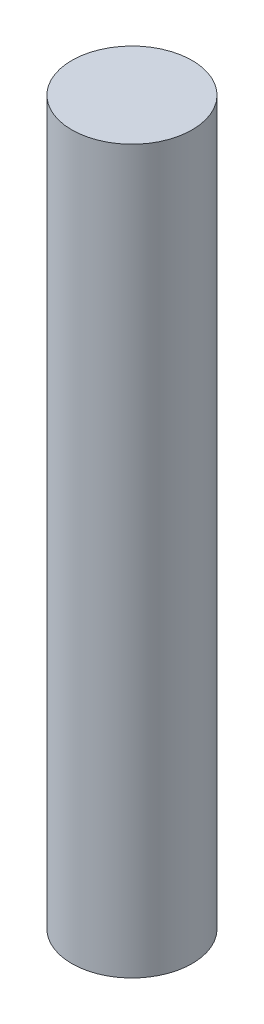
ISO-10303-21;
HEADER;
FILE_DESCRIPTION(('STEP AP214'),'2;1');
FILE_NAME('part.step','',(''),(''),'','','');
FILE_SCHEMA(('AUTOMOTIVE_DESIGN { 1 0 10303 214 1 1 1 1 }'));
ENDSEC;
DATA;
#1=APPLICATION_CONTEXT('core data for automotive mechanical design processes');
#2=APPLICATION_PROTOCOL_DEFINITION('international standard','automotive_design',2000,#1);
#3=PRODUCT_CONTEXT('',#1,'mechanical');
#4=PRODUCT('Part','Part','',(#3));
#5=PRODUCT_RELATED_PRODUCT_CATEGORY('part','',(#4));
#6=PRODUCT_DEFINITION_FORMATION('','',#4);
#7=PRODUCT_DEFINITION_CONTEXT('part definition',#1,'design');
#8=PRODUCT_DEFINITION('design','',#6,#7);
#9=PRODUCT_DEFINITION_SHAPE('','',#8);
#10=(LENGTH_UNIT() NAMED_UNIT(*) SI_UNIT(.MILLI.,.METRE.));
#11=(NAMED_UNIT(*) PLANE_ANGLE_UNIT() SI_UNIT($,.RADIAN.));
#12=(NAMED_UNIT(*) SI_UNIT($,.STERADIAN.) SOLID_ANGLE_UNIT());
#13=UNCERTAINTY_MEASURE_WITH_UNIT(LENGTH_MEASURE(1.E-05),#10,'distance_accuracy_value','');
#14=(GEOMETRIC_REPRESENTATION_CONTEXT(3) GLOBAL_UNCERTAINTY_ASSIGNED_CONTEXT((#13)) GLOBAL_UNIT_ASSIGNED_CONTEXT((#10,
#11,#12)) REPRESENTATION_CONTEXT('',''));
#15=CARTESIAN_POINT('',(0.,0.,0.));
#16=DIRECTION('',(0.,0.,1.));
#17=DIRECTION('',(1.,0.,0.));
#18=AXIS2_PLACEMENT_3D('',#15,#16,#17);
#19=CARTESIAN_POINT('',(0.,30.,0.));
#20=DIRECTION('',(0.,-1.,0.));
#21=DIRECTION('',(0.,0.,-1.));
#22=AXIS2_PLACEMENT_3D('',#19,#20,#21);
#23=CYLINDRICAL_SURFACE('',#22,2.5);
#24=CARTESIAN_POINT('',(0.,30.,0.));
#25=DIRECTION('',(0.,1.,0.));
#26=DIRECTION('',(0.,0.,1.));
#27=AXIS2_PLACEMENT_3D('',#24,#25,#26);
#28=CIRCLE('',#27,2.5);
#29=CARTESIAN_POINT('',(0.,30.,2.5));
#30=VERTEX_POINT('',#29);
#31=EDGE_CURVE('E10',#30,#30,#28,.T.);
#32=ORIENTED_EDGE('',*,*,#31,.F.);
#33=EDGE_LOOP('',(#32));
#34=FACE_BOUND('',#33,.T.);
#35=CARTESIAN_POINT('',(0.,0.,0.));
#36=DIRECTION('',(0.,1.,0.));
#37=DIRECTION('',(0.,0.,1.));
#38=AXIS2_PLACEMENT_3D('',#35,#36,#37);
#39=CIRCLE('',#38,2.5);
#40=CARTESIAN_POINT('',(0.,0.,2.5));
#41=VERTEX_POINT('',#40);
#42=EDGE_CURVE('E36',#41,#41,#39,.T.);
#43=ORIENTED_EDGE('',*,*,#42,.T.);
#44=EDGE_LOOP('',(#43));
#45=FACE_BOUND('',#44,.T.);
#46=ADVANCED_FACE('F33',(#34,#45),#23,.T.);
#47=CARTESIAN_POINT('',(0.,30.,0.));
#48=DIRECTION('',(0.,1.,0.));
#49=DIRECTION('',(0.,0.,1.));
#50=AXIS2_PLACEMENT_3D('',#47,#48,#49);
#51=PLANE('',#50);
#52=ORIENTED_EDGE('',*,*,#31,.T.);
#53=EDGE_LOOP('',(#52));
#54=FACE_BOUND('',#53,.T.);
#55=ADVANCED_FACE('F48',(#54),#51,.T.);
#56=CARTESIAN_POINT('',(0.,0.,0.));
#57=DIRECTION('',(0.,1.,0.));
#58=DIRECTION('',(0.,0.,1.));
#59=AXIS2_PLACEMENT_3D('',#56,#57,#58);
#60=PLANE('',#59);
#61=ORIENTED_EDGE('',*,*,#42,.F.);
#62=EDGE_LOOP('',(#61));
#63=FACE_BOUND('',#62,.T.);
#64=ADVANCED_FACE('F46',(#63),#60,.F.);
#65=CLOSED_SHELL('',(#46,#55,#64));
#66=MANIFOLD_SOLID_BREP('B2',#65);
#67=ADVANCED_BREP_SHAPE_REPRESENTATION('',(#18,#66),#14);
#68=SHAPE_DEFINITION_REPRESENTATION(#9,#67);
ENDSEC;
END-ISO-10303-21;
